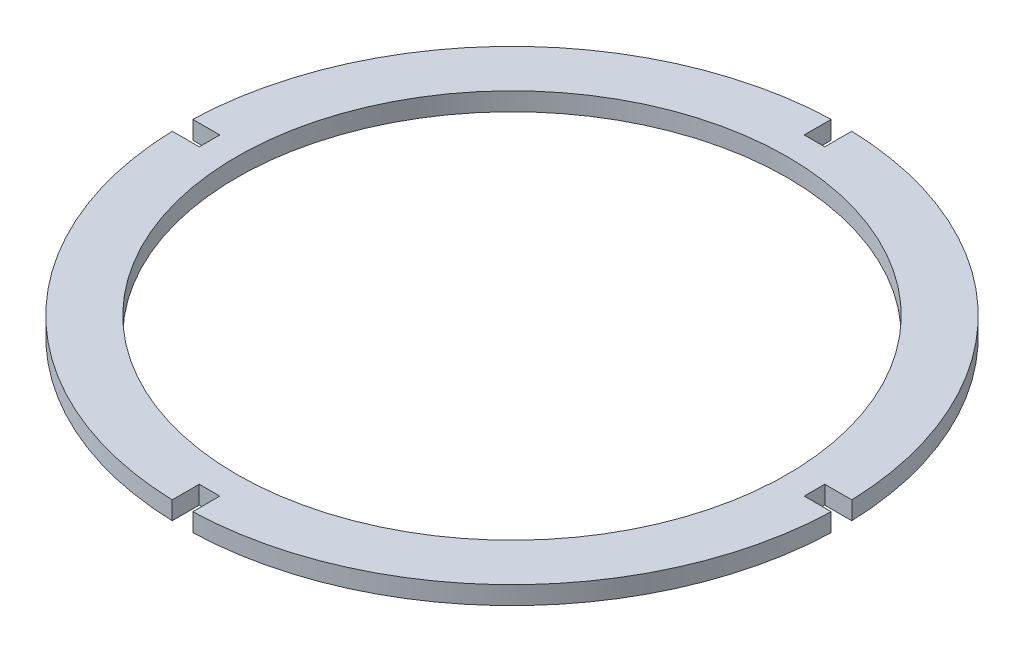
ISO-10303-21;
HEADER;
FILE_DESCRIPTION(('STEP AP214'),'2;1');
FILE_NAME('part.step','',(''),(''),'','','');
FILE_SCHEMA(('AUTOMOTIVE_DESIGN { 1 0 10303 214 1 1 1 1 }'));
ENDSEC;
DATA;
#1=APPLICATION_CONTEXT('core data for automotive mechanical design processes');
#2=APPLICATION_PROTOCOL_DEFINITION('international standard','automotive_design',2000,#1);
#3=PRODUCT_CONTEXT('',#1,'mechanical');
#4=PRODUCT('Part','Part','',(#3));
#5=PRODUCT_RELATED_PRODUCT_CATEGORY('part','',(#4));
#6=PRODUCT_DEFINITION_FORMATION('','',#4);
#7=PRODUCT_DEFINITION_CONTEXT('part definition',#1,'design');
#8=PRODUCT_DEFINITION('design','',#6,#7);
#9=PRODUCT_DEFINITION_SHAPE('','',#8);
#10=(LENGTH_UNIT() NAMED_UNIT(*) SI_UNIT(.MILLI.,.METRE.));
#11=(NAMED_UNIT(*) PLANE_ANGLE_UNIT() SI_UNIT($,.RADIAN.));
#12=(NAMED_UNIT(*) SI_UNIT($,.STERADIAN.) SOLID_ANGLE_UNIT());
#13=UNCERTAINTY_MEASURE_WITH_UNIT(LENGTH_MEASURE(1.E-05),#10,'distance_accuracy_value','');
#14=(GEOMETRIC_REPRESENTATION_CONTEXT(3) GLOBAL_UNCERTAINTY_ASSIGNED_CONTEXT((#13)) GLOBAL_UNIT_ASSIGNED_CONTEXT((#10,
#11,#12)) REPRESENTATION_CONTEXT('',''));
#15=CARTESIAN_POINT('',(0.,0.,0.));
#16=DIRECTION('',(0.,0.,1.));
#17=DIRECTION('',(1.,0.,0.));
#18=AXIS2_PLACEMENT_3D('',#15,#16,#17);
#19=CARTESIAN_POINT('',(0.,1.5,0.));
#20=DIRECTION('',(0.,-1.,0.));
#21=DIRECTION('',(0.,0.,-1.));
#22=AXIS2_PLACEMENT_3D('',#19,#20,#21);
#23=PLANE('',#22);
#24=CARTESIAN_POINT('',(0.,1.5,0.));
#25=DIRECTION('',(0.,1.,0.));
#26=DIRECTION('',(0.,0.,-1.));
#27=AXIS2_PLACEMENT_3D('',#24,#25,#26);
#28=CIRCLE('',#27,54.5);
#29=CARTESIAN_POINT('',(-1.7,1.5,-54.473479786039));
#30=VERTEX_POINT('',#29);
#31=CARTESIAN_POINT('',(-54.473479786039,1.5,-1.7));
#32=VERTEX_POINT('',#31);
#33=EDGE_CURVE('E215',#30,#32,#28,.T.);
#34=ORIENTED_EDGE('',*,*,#33,.T.);
#35=DIRECTION('',(1.,0.,0.));
#36=VECTOR('',#35,1.);
#37=CARTESIAN_POINT('',(-54.473479786039,1.5,-1.7));
#38=LINE('',#37,#36);
#39=CARTESIAN_POINT('',(-50.,1.5,-1.7));
#40=VERTEX_POINT('',#39);
#41=EDGE_CURVE('E123',#32,#40,#38,.T.);
#42=ORIENTED_EDGE('',*,*,#41,.T.);
#43=DIRECTION('',(0.,0.,1.));
#44=VECTOR('',#43,1.);
#45=CARTESIAN_POINT('',(-50.,1.5,-1.7));
#46=LINE('',#45,#44);
#47=CARTESIAN_POINT('',(-50.,1.5,1.7));
#48=VERTEX_POINT('',#47);
#49=EDGE_CURVE('E254',#40,#48,#46,.T.);
#50=ORIENTED_EDGE('',*,*,#49,.T.);
#51=DIRECTION('',(-1.,0.,0.));
#52=VECTOR('',#51,1.);
#53=CARTESIAN_POINT('',(-54.473479786039,1.5,1.7));
#54=LINE('',#53,#52);
#55=CARTESIAN_POINT('',(-54.473479786039,1.5,1.69999999999998));
#56=VERTEX_POINT('',#55);
#57=EDGE_CURVE('E273',#48,#56,#54,.T.);
#58=ORIENTED_EDGE('',*,*,#57,.T.);
#59=CARTESIAN_POINT('',(0.,1.5,0.));
#60=DIRECTION('',(0.,1.,0.));
#61=DIRECTION('',(0.,0.,1.));
#62=AXIS2_PLACEMENT_3D('',#59,#60,#61);
#63=CIRCLE('',#62,54.5);
#64=CARTESIAN_POINT('',(-1.7,1.5,54.473479786039));
#65=VERTEX_POINT('',#64);
#66=EDGE_CURVE('E270',#56,#65,#63,.T.);
#67=ORIENTED_EDGE('',*,*,#66,.T.);
#68=DIRECTION('',(0.,0.,-1.));
#69=VECTOR('',#68,1.);
#70=CARTESIAN_POINT('',(-1.7,1.5,54.473479786039));
#71=LINE('',#70,#69);
#72=CARTESIAN_POINT('',(-1.7,1.5,50.));
#73=VERTEX_POINT('',#72);
#74=EDGE_CURVE('E272',#65,#73,#71,.T.);
#75=ORIENTED_EDGE('',*,*,#74,.T.);
#76=DIRECTION('',(1.,0.,0.));
#77=VECTOR('',#76,1.);
#78=CARTESIAN_POINT('',(-1.7,1.5,50.));
#79=LINE('',#78,#77);
#80=CARTESIAN_POINT('',(1.7,1.5,50.));
#81=VERTEX_POINT('',#80);
#82=EDGE_CURVE('E275',#73,#81,#79,.T.);
#83=ORIENTED_EDGE('',*,*,#82,.T.);
#84=DIRECTION('',(0.,0.,1.));
#85=VECTOR('',#84,1.);
#86=CARTESIAN_POINT('',(1.7,1.5,54.473479786039));
#87=LINE('',#86,#85);
#88=CARTESIAN_POINT('',(1.7,1.5,54.473479786039));
#89=VERTEX_POINT('',#88);
#90=EDGE_CURVE('E281',#81,#89,#87,.T.);
#91=ORIENTED_EDGE('',*,*,#90,.T.);
#92=CARTESIAN_POINT('',(0.,1.5,0.));
#93=DIRECTION('',(0.,1.,0.));
#94=DIRECTION('',(0.,0.,1.));
#95=AXIS2_PLACEMENT_3D('',#92,#93,#94);
#96=CIRCLE('',#95,54.5);
#97=CARTESIAN_POINT('',(54.473479786039,1.5,1.7));
#98=VERTEX_POINT('',#97);
#99=EDGE_CURVE('E283',#89,#98,#96,.T.);
#100=ORIENTED_EDGE('',*,*,#99,.T.);
#101=DIRECTION('',(-1.,0.,0.));
#102=VECTOR('',#101,1.);
#103=CARTESIAN_POINT('',(54.473479786039,1.5,1.7));
#104=LINE('',#103,#102);
#105=CARTESIAN_POINT('',(50.,1.5,1.7));
#106=VERTEX_POINT('',#105);
#107=EDGE_CURVE('E285',#98,#106,#104,.T.);
#108=ORIENTED_EDGE('',*,*,#107,.T.);
#109=DIRECTION('',(0.,0.,-1.));
#110=VECTOR('',#109,1.);
#111=CARTESIAN_POINT('',(50.,1.5,-1.7));
#112=LINE('',#111,#110);
#113=CARTESIAN_POINT('',(50.,1.5,-1.7));
#114=VERTEX_POINT('',#113);
#115=EDGE_CURVE('E287',#106,#114,#112,.T.);
#116=ORIENTED_EDGE('',*,*,#115,.T.);
#117=DIRECTION('',(1.,0.,0.));
#118=VECTOR('',#117,1.);
#119=CARTESIAN_POINT('',(54.473479786039,1.5,-1.7));
#120=LINE('',#119,#118);
#121=CARTESIAN_POINT('',(54.473479786039,1.5,-1.7));
#122=VERTEX_POINT('',#121);
#123=EDGE_CURVE('E289',#114,#122,#120,.T.);
#124=ORIENTED_EDGE('',*,*,#123,.T.);
#125=CARTESIAN_POINT('',(0.,1.5,0.));
#126=DIRECTION('',(0.,1.,0.));
#127=DIRECTION('',(0.,0.,1.));
#128=AXIS2_PLACEMENT_3D('',#125,#126,#127);
#129=CIRCLE('',#128,54.5);
#130=CARTESIAN_POINT('',(1.7,1.5,-54.473479786039));
#131=VERTEX_POINT('',#130);
#132=EDGE_CURVE('E166',#122,#131,#129,.T.);
#133=ORIENTED_EDGE('',*,*,#132,.T.);
#134=DIRECTION('',(0.,0.,1.));
#135=VECTOR('',#134,1.);
#136=CARTESIAN_POINT('',(1.7,1.5,-54.473479786039));
#137=LINE('',#136,#135);
#138=CARTESIAN_POINT('',(1.7,1.5,-50.));
#139=VERTEX_POINT('',#138);
#140=EDGE_CURVE('E160',#131,#139,#137,.T.);
#141=ORIENTED_EDGE('',*,*,#140,.T.);
#142=DIRECTION('',(-1.,0.,0.));
#143=VECTOR('',#142,1.);
#144=CARTESIAN_POINT('',(-1.7,1.5,-50.));
#145=LINE('',#144,#143);
#146=CARTESIAN_POINT('',(-1.7,1.5,-50.));
#147=VERTEX_POINT('',#146);
#148=EDGE_CURVE('E164',#139,#147,#145,.T.);
#149=ORIENTED_EDGE('',*,*,#148,.T.);
#150=DIRECTION('',(0.,0.,-1.));
#151=VECTOR('',#150,1.);
#152=CARTESIAN_POINT('',(-1.7,1.5,-54.473479786039));
#153=LINE('',#152,#151);
#154=EDGE_CURVE('E56',#147,#30,#153,.T.);
#155=ORIENTED_EDGE('',*,*,#154,.T.);
#156=EDGE_LOOP('',(#34,#42,#50,#58,#67,#75,#83,#91,#100,#108,#116,#124,#133,#141,#149,#155));
#157=FACE_BOUND('',#156,.T.);
#158=CARTESIAN_POINT('',(0.,1.5,0.));
#159=DIRECTION('',(0.,1.,0.));
#160=DIRECTION('',(0.,0.,1.));
#161=AXIS2_PLACEMENT_3D('',#158,#159,#160);
#162=CIRCLE('',#161,45.5);
#163=CARTESIAN_POINT('',(0.,1.5,45.5));
#164=VERTEX_POINT('',#163);
#165=EDGE_CURVE('E188',#164,#164,#162,.T.);
#166=ORIENTED_EDGE('',*,*,#165,.F.);
#167=EDGE_LOOP('',(#166));
#168=FACE_BOUND('',#167,.T.);
#169=ADVANCED_FACE('F39',(#157,#168),#23,.F.);
#170=CARTESIAN_POINT('',(0.,-1.5,0.));
#171=DIRECTION('',(0.,-1.,0.));
#172=DIRECTION('',(0.,0.,-1.));
#173=AXIS2_PLACEMENT_3D('',#170,#171,#172);
#174=PLANE('',#173);
#175=CARTESIAN_POINT('',(0.,-1.5,0.));
#176=DIRECTION('',(0.,1.,0.));
#177=DIRECTION('',(0.,0.,-1.));
#178=AXIS2_PLACEMENT_3D('',#175,#176,#177);
#179=CIRCLE('',#178,54.5);
#180=CARTESIAN_POINT('',(-1.7,-1.5,-54.473479786039));
#181=VERTEX_POINT('',#180);
#182=CARTESIAN_POINT('',(-54.473479786039,-1.5,-1.7));
#183=VERTEX_POINT('',#182);
#184=EDGE_CURVE('E184',#181,#183,#179,.T.);
#185=ORIENTED_EDGE('',*,*,#184,.F.);
#186=DIRECTION('',(0.,0.,-1.));
#187=VECTOR('',#186,1.);
#188=CARTESIAN_POINT('',(-1.7,-1.5,-54.473479786039));
#189=LINE('',#188,#187);
#190=CARTESIAN_POINT('',(-1.7,-1.5,-50.));
#191=VERTEX_POINT('',#190);
#192=EDGE_CURVE('E115',#191,#181,#189,.T.);
#193=ORIENTED_EDGE('',*,*,#192,.F.);
#194=DIRECTION('',(-1.,0.,0.));
#195=VECTOR('',#194,1.);
#196=CARTESIAN_POINT('',(-1.7,-1.5,-50.));
#197=LINE('',#196,#195);
#198=CARTESIAN_POINT('',(1.7,-1.5,-50.));
#199=VERTEX_POINT('',#198);
#200=EDGE_CURVE('E109',#199,#191,#197,.T.);
#201=ORIENTED_EDGE('',*,*,#200,.F.);
#202=DIRECTION('',(0.,0.,1.));
#203=VECTOR('',#202,1.);
#204=CARTESIAN_POINT('',(1.7,-1.5,-54.473479786039));
#205=LINE('',#204,#203);
#206=CARTESIAN_POINT('',(1.7,-1.5,-54.473479786039));
#207=VERTEX_POINT('',#206);
#208=EDGE_CURVE('E174',#207,#199,#205,.T.);
#209=ORIENTED_EDGE('',*,*,#208,.F.);
#210=CARTESIAN_POINT('',(0.,-1.5,0.));
#211=DIRECTION('',(0.,1.,0.));
#212=DIRECTION('',(0.,0.,1.));
#213=AXIS2_PLACEMENT_3D('',#210,#211,#212);
#214=CIRCLE('',#213,54.5);
#215=CARTESIAN_POINT('',(54.473479786039,-1.5,-1.7));
#216=VERTEX_POINT('',#215);
#217=EDGE_CURVE('E210',#216,#207,#214,.T.);
#218=ORIENTED_EDGE('',*,*,#217,.F.);
#219=DIRECTION('',(1.,0.,0.));
#220=VECTOR('',#219,1.);
#221=CARTESIAN_POINT('',(54.473479786039,-1.5,-1.7));
#222=LINE('',#221,#220);
#223=CARTESIAN_POINT('',(50.,-1.5,-1.7));
#224=VERTEX_POINT('',#223);
#225=EDGE_CURVE('E208',#224,#216,#222,.T.);
#226=ORIENTED_EDGE('',*,*,#225,.F.);
#227=DIRECTION('',(0.,0.,-1.));
#228=VECTOR('',#227,1.);
#229=CARTESIAN_POINT('',(50.,-1.5,-1.7));
#230=LINE('',#229,#228);
#231=CARTESIAN_POINT('',(50.,-1.5,1.7));
#232=VERTEX_POINT('',#231);
#233=EDGE_CURVE('E206',#232,#224,#230,.T.);
#234=ORIENTED_EDGE('',*,*,#233,.F.);
#235=DIRECTION('',(-1.,0.,0.));
#236=VECTOR('',#235,1.);
#237=CARTESIAN_POINT('',(54.473479786039,-1.5,1.7));
#238=LINE('',#237,#236);
#239=CARTESIAN_POINT('',(54.473479786039,-1.5,1.7));
#240=VERTEX_POINT('',#239);
#241=EDGE_CURVE('E204',#240,#232,#238,.T.);
#242=ORIENTED_EDGE('',*,*,#241,.F.);
#243=CARTESIAN_POINT('',(0.,-1.5,0.));
#244=DIRECTION('',(0.,1.,0.));
#245=DIRECTION('',(0.,0.,1.));
#246=AXIS2_PLACEMENT_3D('',#243,#244,#245);
#247=CIRCLE('',#246,54.5);
#248=CARTESIAN_POINT('',(1.7,-1.5,54.473479786039));
#249=VERTEX_POINT('',#248);
#250=EDGE_CURVE('E202',#249,#240,#247,.T.);
#251=ORIENTED_EDGE('',*,*,#250,.F.);
#252=DIRECTION('',(0.,0.,1.));
#253=VECTOR('',#252,1.);
#254=CARTESIAN_POINT('',(1.7,-1.5,54.473479786039));
#255=LINE('',#254,#253);
#256=CARTESIAN_POINT('',(1.7,-1.5,50.));
#257=VERTEX_POINT('',#256);
#258=EDGE_CURVE('E200',#257,#249,#255,.T.);
#259=ORIENTED_EDGE('',*,*,#258,.F.);
#260=DIRECTION('',(1.,0.,0.));
#261=VECTOR('',#260,1.);
#262=CARTESIAN_POINT('',(-1.7,-1.5,50.));
#263=LINE('',#262,#261);
#264=CARTESIAN_POINT('',(-1.7,-1.5,50.));
#265=VERTEX_POINT('',#264);
#266=EDGE_CURVE('E198',#265,#257,#263,.T.);
#267=ORIENTED_EDGE('',*,*,#266,.F.);
#268=DIRECTION('',(0.,0.,-1.));
#269=VECTOR('',#268,1.);
#270=CARTESIAN_POINT('',(-1.7,-1.5,54.473479786039));
#271=LINE('',#270,#269);
#272=CARTESIAN_POINT('',(-1.7,-1.5,54.473479786039));
#273=VERTEX_POINT('',#272);
#274=EDGE_CURVE('E196',#273,#265,#271,.T.);
#275=ORIENTED_EDGE('',*,*,#274,.F.);
#276=CARTESIAN_POINT('',(0.,-1.5,0.));
#277=DIRECTION('',(0.,1.,0.));
#278=DIRECTION('',(0.,0.,1.));
#279=AXIS2_PLACEMENT_3D('',#276,#277,#278);
#280=CIRCLE('',#279,54.5);
#281=CARTESIAN_POINT('',(-54.473479786039,-1.5,1.69999999999998));
#282=VERTEX_POINT('',#281);
#283=EDGE_CURVE('E194',#282,#273,#280,.T.);
#284=ORIENTED_EDGE('',*,*,#283,.F.);
#285=DIRECTION('',(-1.,0.,0.));
#286=VECTOR('',#285,1.);
#287=CARTESIAN_POINT('',(-54.473479786039,-1.5,1.7));
#288=LINE('',#287,#286);
#289=CARTESIAN_POINT('',(-50.,-1.5,1.7));
#290=VERTEX_POINT('',#289);
#291=EDGE_CURVE('E192',#290,#282,#288,.T.);
#292=ORIENTED_EDGE('',*,*,#291,.F.);
#293=DIRECTION('',(0.,0.,1.));
#294=VECTOR('',#293,1.);
#295=CARTESIAN_POINT('',(-50.,-1.5,-1.7));
#296=LINE('',#295,#294);
#297=CARTESIAN_POINT('',(-50.,-1.5,-1.7));
#298=VERTEX_POINT('',#297);
#299=EDGE_CURVE('E190',#298,#290,#296,.T.);
#300=ORIENTED_EDGE('',*,*,#299,.F.);
#301=DIRECTION('',(1.,0.,0.));
#302=VECTOR('',#301,1.);
#303=CARTESIAN_POINT('',(-54.473479786039,-1.5,-1.7));
#304=LINE('',#303,#302);
#305=EDGE_CURVE('E187',#183,#298,#304,.T.);
#306=ORIENTED_EDGE('',*,*,#305,.F.);
#307=EDGE_LOOP('',(#185,#193,#201,#209,#218,#226,#234,#242,#251,#259,#267,#275,#284,#292,#300,#306));
#308=FACE_BOUND('',#307,.T.);
#309=CARTESIAN_POINT('',(0.,-1.5,0.));
#310=DIRECTION('',(0.,1.,0.));
#311=DIRECTION('',(0.,0.,1.));
#312=AXIS2_PLACEMENT_3D('',#309,#310,#311);
#313=CIRCLE('',#312,45.5);
#314=CARTESIAN_POINT('',(0.,-1.5,45.5));
#315=VERTEX_POINT('',#314);
#316=EDGE_CURVE('E488',#315,#315,#313,.T.);
#317=ORIENTED_EDGE('',*,*,#316,.T.);
#318=EDGE_LOOP('',(#317));
#319=FACE_BOUND('',#318,.T.);
#320=ADVANCED_FACE('F258',(#308,#319),#174,.T.);
#321=CARTESIAN_POINT('',(0.,1.5,0.));
#322=DIRECTION('',(0.,-1.,0.));
#323=DIRECTION('',(0.,0.,-1.));
#324=AXIS2_PLACEMENT_3D('',#321,#322,#323);
#325=CYLINDRICAL_SURFACE('',#324,54.5);
#326=ORIENTED_EDGE('',*,*,#184,.T.);
#327=DIRECTION('',(0.,-1.,0.));
#328=VECTOR('',#327,1.);
#329=CARTESIAN_POINT('',(-54.473479786039,1.5,-1.7));
#330=LINE('',#329,#328);
#331=EDGE_CURVE('E11',#32,#183,#330,.T.);
#332=ORIENTED_EDGE('',*,*,#331,.F.);
#333=ORIENTED_EDGE('',*,*,#33,.F.);
#334=DIRECTION('',(0.,-1.,0.));
#335=VECTOR('',#334,1.);
#336=CARTESIAN_POINT('',(-1.7,1.5,-54.473479786039));
#337=LINE('',#336,#335);
#338=EDGE_CURVE('E180',#30,#181,#337,.T.);
#339=ORIENTED_EDGE('',*,*,#338,.T.);
#340=EDGE_LOOP('',(#326,#332,#333,#339));
#341=FACE_BOUND('',#340,.T.);
#342=ADVANCED_FACE('F41',(#341),#325,.T.);
#343=CARTESIAN_POINT('',(-54.473479786039,1.5,-1.7));
#344=DIRECTION('',(0.,0.,-1.));
#345=DIRECTION('',(-1.,0.,0.));
#346=AXIS2_PLACEMENT_3D('',#343,#344,#345);
#347=PLANE('',#346);
#348=ORIENTED_EDGE('',*,*,#305,.T.);
#349=DIRECTION('',(0.,-1.,0.));
#350=VECTOR('',#349,1.);
#351=CARTESIAN_POINT('',(-50.,1.5,-1.7));
#352=LINE('',#351,#350);
#353=EDGE_CURVE('E48',#40,#298,#352,.T.);
#354=ORIENTED_EDGE('',*,*,#353,.F.);
#355=ORIENTED_EDGE('',*,*,#41,.F.);
#356=ORIENTED_EDGE('',*,*,#331,.T.);
#357=EDGE_LOOP('',(#348,#354,#355,#356));
#358=FACE_BOUND('',#357,.T.);
#359=ADVANCED_FACE('F323',(#358),#347,.F.);
#360=CARTESIAN_POINT('',(-50.,1.5,-1.7));
#361=DIRECTION('',(1.,0.,0.));
#362=DIRECTION('',(0.,0.,-1.));
#363=AXIS2_PLACEMENT_3D('',#360,#361,#362);
#364=PLANE('',#363);
#365=ORIENTED_EDGE('',*,*,#299,.T.);
#366=DIRECTION('',(0.,-1.,0.));
#367=VECTOR('',#366,1.);
#368=CARTESIAN_POINT('',(-50.,1.5,1.7));
#369=LINE('',#368,#367);
#370=EDGE_CURVE('E246',#48,#290,#369,.T.);
#371=ORIENTED_EDGE('',*,*,#370,.F.);
#372=ORIENTED_EDGE('',*,*,#49,.F.);
#373=ORIENTED_EDGE('',*,*,#353,.T.);
#374=EDGE_LOOP('',(#365,#371,#372,#373));
#375=FACE_BOUND('',#374,.T.);
#376=ADVANCED_FACE('F252',(#375),#364,.F.);
#377=CARTESIAN_POINT('',(-54.473479786039,1.5,1.7));
#378=DIRECTION('',(0.,0.,1.));
#379=DIRECTION('',(1.,0.,0.));
#380=AXIS2_PLACEMENT_3D('',#377,#378,#379);
#381=PLANE('',#380);
#382=ORIENTED_EDGE('',*,*,#291,.T.);
#383=DIRECTION('',(0.,-1.,0.));
#384=VECTOR('',#383,1.);
#385=CARTESIAN_POINT('',(-54.473479786039,1.5,1.69999999999998));
#386=LINE('',#385,#384);
#387=EDGE_CURVE('E243',#56,#282,#386,.T.);
#388=ORIENTED_EDGE('',*,*,#387,.F.);
#389=ORIENTED_EDGE('',*,*,#57,.F.);
#390=ORIENTED_EDGE('',*,*,#370,.T.);
#391=EDGE_LOOP('',(#382,#388,#389,#390));
#392=FACE_BOUND('',#391,.T.);
#393=ADVANCED_FACE('F264',(#392),#381,.F.);
#394=CARTESIAN_POINT('',(0.,1.5,0.));
#395=DIRECTION('',(0.,-1.,0.));
#396=DIRECTION('',(0.,0.,-1.));
#397=AXIS2_PLACEMENT_3D('',#394,#395,#396);
#398=CYLINDRICAL_SURFACE('',#397,54.5);
#399=ORIENTED_EDGE('',*,*,#283,.T.);
#400=DIRECTION('',(0.,-1.,0.));
#401=VECTOR('',#400,1.);
#402=CARTESIAN_POINT('',(-1.7,1.5,54.473479786039));
#403=LINE('',#402,#401);
#404=EDGE_CURVE('E240',#65,#273,#403,.T.);
#405=ORIENTED_EDGE('',*,*,#404,.F.);
#406=ORIENTED_EDGE('',*,*,#66,.F.);
#407=ORIENTED_EDGE('',*,*,#387,.T.);
#408=EDGE_LOOP('',(#399,#405,#406,#407));
#409=FACE_BOUND('',#408,.T.);
#410=ADVANCED_FACE('F268',(#409),#398,.T.);
#411=CARTESIAN_POINT('',(-1.7,1.5,54.473479786039));
#412=DIRECTION('',(-1.,0.,0.));
#413=DIRECTION('',(0.,0.,1.));
#414=AXIS2_PLACEMENT_3D('',#411,#412,#413);
#415=PLANE('',#414);
#416=ORIENTED_EDGE('',*,*,#274,.T.);
#417=DIRECTION('',(0.,-1.,0.));
#418=VECTOR('',#417,1.);
#419=CARTESIAN_POINT('',(-1.7,1.5,50.));
#420=LINE('',#419,#418);
#421=EDGE_CURVE('E237',#73,#265,#420,.T.);
#422=ORIENTED_EDGE('',*,*,#421,.F.);
#423=ORIENTED_EDGE('',*,*,#74,.F.);
#424=ORIENTED_EDGE('',*,*,#404,.T.);
#425=EDGE_LOOP('',(#416,#422,#423,#424));
#426=FACE_BOUND('',#425,.T.);
#427=ADVANCED_FACE('F336',(#426),#415,.F.);
#428=CARTESIAN_POINT('',(-1.7,1.5,50.));
#429=DIRECTION('',(0.,0.,-1.));
#430=DIRECTION('',(-1.,0.,0.));
#431=AXIS2_PLACEMENT_3D('',#428,#429,#430);
#432=PLANE('',#431);
#433=ORIENTED_EDGE('',*,*,#266,.T.);
#434=DIRECTION('',(0.,-1.,0.));
#435=VECTOR('',#434,1.);
#436=CARTESIAN_POINT('',(1.7,1.5,50.));
#437=LINE('',#436,#435);
#438=EDGE_CURVE('E234',#81,#257,#437,.T.);
#439=ORIENTED_EDGE('',*,*,#438,.F.);
#440=ORIENTED_EDGE('',*,*,#82,.F.);
#441=ORIENTED_EDGE('',*,*,#421,.T.);
#442=EDGE_LOOP('',(#433,#439,#440,#441));
#443=FACE_BOUND('',#442,.T.);
#444=ADVANCED_FACE('F339',(#443),#432,.F.);
#445=CARTESIAN_POINT('',(1.7,1.5,54.473479786039));
#446=DIRECTION('',(1.,0.,0.));
#447=DIRECTION('',(0.,0.,-1.));
#448=AXIS2_PLACEMENT_3D('',#445,#446,#447);
#449=PLANE('',#448);
#450=ORIENTED_EDGE('',*,*,#258,.T.);
#451=DIRECTION('',(0.,-1.,0.));
#452=VECTOR('',#451,1.);
#453=CARTESIAN_POINT('',(1.7,1.5,54.473479786039));
#454=LINE('',#453,#452);
#455=EDGE_CURVE('E231',#89,#249,#454,.T.);
#456=ORIENTED_EDGE('',*,*,#455,.F.);
#457=ORIENTED_EDGE('',*,*,#90,.F.);
#458=ORIENTED_EDGE('',*,*,#438,.T.);
#459=EDGE_LOOP('',(#450,#456,#457,#458));
#460=FACE_BOUND('',#459,.T.);
#461=ADVANCED_FACE('F343',(#460),#449,.F.);
#462=CARTESIAN_POINT('',(0.,1.5,0.));
#463=DIRECTION('',(0.,-1.,0.));
#464=DIRECTION('',(0.,0.,-1.));
#465=AXIS2_PLACEMENT_3D('',#462,#463,#464);
#466=CYLINDRICAL_SURFACE('',#465,54.5);
#467=ORIENTED_EDGE('',*,*,#250,.T.);
#468=DIRECTION('',(0.,-1.,0.));
#469=VECTOR('',#468,1.);
#470=CARTESIAN_POINT('',(54.473479786039,1.5,1.7));
#471=LINE('',#470,#469);
#472=EDGE_CURVE('E228',#98,#240,#471,.T.);
#473=ORIENTED_EDGE('',*,*,#472,.F.);
#474=ORIENTED_EDGE('',*,*,#99,.F.);
#475=ORIENTED_EDGE('',*,*,#455,.T.);
#476=EDGE_LOOP('',(#467,#473,#474,#475));
#477=FACE_BOUND('',#476,.T.);
#478=ADVANCED_FACE('F347',(#477),#466,.T.);
#479=CARTESIAN_POINT('',(54.473479786039,1.5,1.7));
#480=DIRECTION('',(0.,0.,1.));
#481=DIRECTION('',(1.,0.,0.));
#482=AXIS2_PLACEMENT_3D('',#479,#480,#481);
#483=PLANE('',#482);
#484=ORIENTED_EDGE('',*,*,#241,.T.);
#485=DIRECTION('',(0.,-1.,0.));
#486=VECTOR('',#485,1.);
#487=CARTESIAN_POINT('',(50.,1.5,1.7));
#488=LINE('',#487,#486);
#489=EDGE_CURVE('E225',#106,#232,#488,.T.);
#490=ORIENTED_EDGE('',*,*,#489,.F.);
#491=ORIENTED_EDGE('',*,*,#107,.F.);
#492=ORIENTED_EDGE('',*,*,#472,.T.);
#493=EDGE_LOOP('',(#484,#490,#491,#492));
#494=FACE_BOUND('',#493,.T.);
#495=ADVANCED_FACE('F351',(#494),#483,.F.);
#496=CARTESIAN_POINT('',(50.,1.5,-1.7));
#497=DIRECTION('',(-1.,0.,0.));
#498=DIRECTION('',(0.,0.,1.));
#499=AXIS2_PLACEMENT_3D('',#496,#497,#498);
#500=PLANE('',#499);
#501=ORIENTED_EDGE('',*,*,#233,.T.);
#502=DIRECTION('',(0.,-1.,0.));
#503=VECTOR('',#502,1.);
#504=CARTESIAN_POINT('',(50.,1.5,-1.7));
#505=LINE('',#504,#503);
#506=EDGE_CURVE('E222',#114,#224,#505,.T.);
#507=ORIENTED_EDGE('',*,*,#506,.F.);
#508=ORIENTED_EDGE('',*,*,#115,.F.);
#509=ORIENTED_EDGE('',*,*,#489,.T.);
#510=EDGE_LOOP('',(#501,#507,#508,#509));
#511=FACE_BOUND('',#510,.T.);
#512=ADVANCED_FACE('F355',(#511),#500,.F.);
#513=CARTESIAN_POINT('',(54.473479786039,1.5,-1.7));
#514=DIRECTION('',(0.,0.,-1.));
#515=DIRECTION('',(-1.,0.,0.));
#516=AXIS2_PLACEMENT_3D('',#513,#514,#515);
#517=PLANE('',#516);
#518=ORIENTED_EDGE('',*,*,#225,.T.);
#519=DIRECTION('',(0.,-1.,0.));
#520=VECTOR('',#519,1.);
#521=CARTESIAN_POINT('',(54.473479786039,1.5,-1.7));
#522=LINE('',#521,#520);
#523=EDGE_CURVE('E219',#122,#216,#522,.T.);
#524=ORIENTED_EDGE('',*,*,#523,.F.);
#525=ORIENTED_EDGE('',*,*,#123,.F.);
#526=ORIENTED_EDGE('',*,*,#506,.T.);
#527=EDGE_LOOP('',(#518,#524,#525,#526));
#528=FACE_BOUND('',#527,.T.);
#529=ADVANCED_FACE('F295',(#528),#517,.F.);
#530=CARTESIAN_POINT('',(0.,1.5,0.));
#531=DIRECTION('',(0.,-1.,0.));
#532=DIRECTION('',(0.,0.,-1.));
#533=AXIS2_PLACEMENT_3D('',#530,#531,#532);
#534=CYLINDRICAL_SURFACE('',#533,54.5);
#535=ORIENTED_EDGE('',*,*,#217,.T.);
#536=DIRECTION('',(0.,-1.,0.));
#537=VECTOR('',#536,1.);
#538=CARTESIAN_POINT('',(1.7,1.5,-54.473479786039));
#539=LINE('',#538,#537);
#540=EDGE_CURVE('E175',#131,#207,#539,.T.);
#541=ORIENTED_EDGE('',*,*,#540,.F.);
#542=ORIENTED_EDGE('',*,*,#132,.F.);
#543=ORIENTED_EDGE('',*,*,#523,.T.);
#544=EDGE_LOOP('',(#535,#541,#542,#543));
#545=FACE_BOUND('',#544,.T.);
#546=ADVANCED_FACE('F299',(#545),#534,.T.);
#547=CARTESIAN_POINT('',(1.7,1.5,-54.473479786039));
#548=DIRECTION('',(1.,0.,0.));
#549=DIRECTION('',(0.,0.,-1.));
#550=AXIS2_PLACEMENT_3D('',#547,#548,#549);
#551=PLANE('',#550);
#552=ORIENTED_EDGE('',*,*,#208,.T.);
#553=DIRECTION('',(0.,-1.,0.));
#554=VECTOR('',#553,1.);
#555=CARTESIAN_POINT('',(1.7,1.5,-50.));
#556=LINE('',#555,#554);
#557=EDGE_CURVE('E171',#139,#199,#556,.T.);
#558=ORIENTED_EDGE('',*,*,#557,.F.);
#559=ORIENTED_EDGE('',*,*,#140,.F.);
#560=ORIENTED_EDGE('',*,*,#540,.T.);
#561=EDGE_LOOP('',(#552,#558,#559,#560));
#562=FACE_BOUND('',#561,.T.);
#563=ADVANCED_FACE('F172',(#562),#551,.F.);
#564=CARTESIAN_POINT('',(-1.7,1.5,-50.));
#565=DIRECTION('',(0.,0.,1.));
#566=DIRECTION('',(1.,0.,0.));
#567=AXIS2_PLACEMENT_3D('',#564,#565,#566);
#568=PLANE('',#567);
#569=ORIENTED_EDGE('',*,*,#200,.T.);
#570=DIRECTION('',(0.,-1.,0.));
#571=VECTOR('',#570,1.);
#572=CARTESIAN_POINT('',(-1.7,1.5,-50.));
#573=LINE('',#572,#571);
#574=EDGE_CURVE('E176',#147,#191,#573,.T.);
#575=ORIENTED_EDGE('',*,*,#574,.F.);
#576=ORIENTED_EDGE('',*,*,#148,.F.);
#577=ORIENTED_EDGE('',*,*,#557,.T.);
#578=EDGE_LOOP('',(#569,#575,#576,#577));
#579=FACE_BOUND('',#578,.T.);
#580=ADVANCED_FACE('F178',(#579),#568,.F.);
#581=CARTESIAN_POINT('',(-1.7,1.5,-54.473479786039));
#582=DIRECTION('',(-1.,0.,0.));
#583=DIRECTION('',(0.,0.,1.));
#584=AXIS2_PLACEMENT_3D('',#581,#582,#583);
#585=PLANE('',#584);
#586=ORIENTED_EDGE('',*,*,#192,.T.);
#587=ORIENTED_EDGE('',*,*,#338,.F.);
#588=ORIENTED_EDGE('',*,*,#154,.F.);
#589=ORIENTED_EDGE('',*,*,#574,.T.);
#590=EDGE_LOOP('',(#586,#587,#588,#589));
#591=FACE_BOUND('',#590,.T.);
#592=ADVANCED_FACE('F303',(#591),#585,.F.);
#593=CARTESIAN_POINT('',(0.,1.5,0.));
#594=DIRECTION('',(0.,-1.,0.));
#595=DIRECTION('',(0.,0.,-1.));
#596=AXIS2_PLACEMENT_3D('',#593,#594,#595);
#597=CYLINDRICAL_SURFACE('',#596,45.5);
#598=ORIENTED_EDGE('',*,*,#165,.T.);
#599=EDGE_LOOP('',(#598));
#600=FACE_BOUND('',#599,.T.);
#601=ORIENTED_EDGE('',*,*,#316,.F.);
#602=EDGE_LOOP('',(#601));
#603=FACE_BOUND('',#602,.T.);
#604=ADVANCED_FACE('F305',(#600,#603),#597,.F.);
#605=CLOSED_SHELL('',(#169,#320,#342,#359,#376,#393,#410,#427,#444,#461,#478,#495,#512,#529,
#546,#563,#580,#592,#604));
#606=MANIFOLD_SOLID_BREP('B2',#605);
#607=ADVANCED_BREP_SHAPE_REPRESENTATION('',(#18,#606),#14);
#608=SHAPE_DEFINITION_REPRESENTATION(#9,#607);
ENDSEC;
END-ISO-10303-21;
